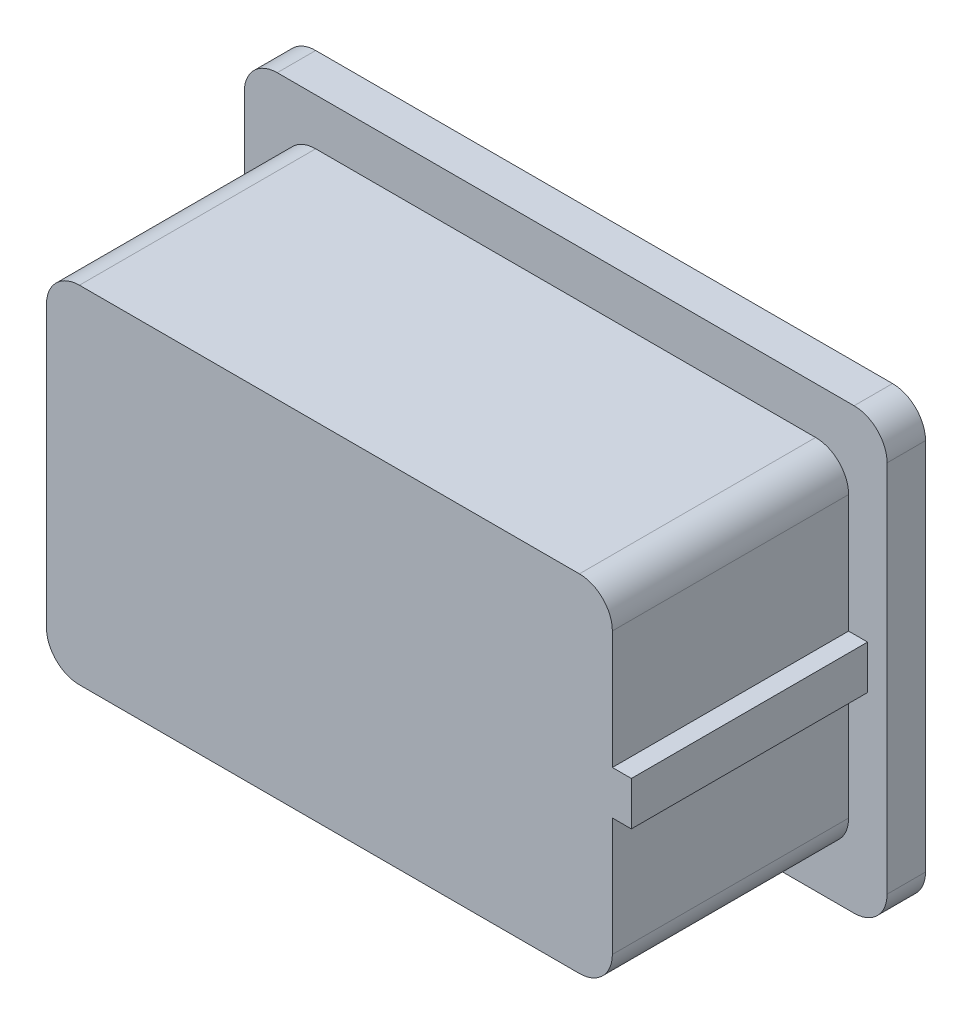
ISO-10303-21;
HEADER;
FILE_DESCRIPTION(('STEP AP214'),'2;1');
FILE_NAME('part.step','',(''),(''),'','','');
FILE_SCHEMA(('AUTOMOTIVE_DESIGN { 1 0 10303 214 1 1 1 1 }'));
ENDSEC;
DATA;
#1=APPLICATION_CONTEXT('core data for automotive mechanical design processes');
#2=APPLICATION_PROTOCOL_DEFINITION('international standard','automotive_design',2000,#1);
#3=PRODUCT_CONTEXT('',#1,'mechanical');
#4=PRODUCT('Part','Part','',(#3));
#5=PRODUCT_RELATED_PRODUCT_CATEGORY('part','',(#4));
#6=PRODUCT_DEFINITION_FORMATION('','',#4);
#7=PRODUCT_DEFINITION_CONTEXT('part definition',#1,'design');
#8=PRODUCT_DEFINITION('design','',#6,#7);
#9=PRODUCT_DEFINITION_SHAPE('','',#8);
#10=(LENGTH_UNIT() NAMED_UNIT(*) SI_UNIT(.MILLI.,.METRE.));
#11=(NAMED_UNIT(*) PLANE_ANGLE_UNIT() SI_UNIT($,.RADIAN.));
#12=(NAMED_UNIT(*) SI_UNIT($,.STERADIAN.) SOLID_ANGLE_UNIT());
#13=UNCERTAINTY_MEASURE_WITH_UNIT(LENGTH_MEASURE(1.E-05),#10,'distance_accuracy_value','');
#14=(GEOMETRIC_REPRESENTATION_CONTEXT(3) GLOBAL_UNCERTAINTY_ASSIGNED_CONTEXT((#13)) GLOBAL_UNIT_ASSIGNED_CONTEXT((#10,
#11,#12)) REPRESENTATION_CONTEXT('',''));
#15=CARTESIAN_POINT('',(0.,0.,0.));
#16=DIRECTION('',(0.,0.,1.));
#17=DIRECTION('',(1.,0.,0.));
#18=AXIS2_PLACEMENT_3D('',#15,#16,#17);
#19=CARTESIAN_POINT('',(25.75,-15.75,3.5));
#20=DIRECTION('',(1.,0.,0.));
#21=DIRECTION('',(0.,0.,-1.));
#22=AXIS2_PLACEMENT_3D('',#19,#20,#21);
#23=PLANE('',#22);
#24=DIRECTION('',(0.,1.,0.));
#25=VECTOR('',#24,1.);
#26=CARTESIAN_POINT('',(25.75,-15.75,3.5));
#27=LINE('',#26,#25);
#28=CARTESIAN_POINT('',(25.75,1.98869366048493,3.49999999997408));
#29=VERTEX_POINT('',#28);
#30=CARTESIAN_POINT('',(25.75,12.75,3.5));
#31=VERTEX_POINT('',#30);
#32=EDGE_CURVE('E218',#29,#31,#27,.T.);
#33=ORIENTED_EDGE('',*,*,#32,.T.);
#34=DIRECTION('',(0.,0.,1.));
#35=VECTOR('',#34,1.);
#36=CARTESIAN_POINT('',(25.75,12.75,3.5));
#37=LINE('',#36,#35);
#38=CARTESIAN_POINT('',(25.75,12.75,25.));
#39=VERTEX_POINT('',#38);
#40=EDGE_CURVE('E255',#31,#39,#37,.T.);
#41=ORIENTED_EDGE('',*,*,#40,.T.);
#42=DIRECTION('',(0.,1.,0.));
#43=VECTOR('',#42,1.);
#44=CARTESIAN_POINT('',(25.75,-15.75,25.));
#45=LINE('',#44,#43);
#46=CARTESIAN_POINT('',(25.75,1.98869366048493,25.));
#47=VERTEX_POINT('',#46);
#48=EDGE_CURVE('E205',#47,#39,#45,.T.);
#49=ORIENTED_EDGE('',*,*,#48,.F.);
#50=DIRECTION('',(0.,0.,-1.));
#51=VECTOR('',#50,1.);
#52=CARTESIAN_POINT('',(25.75,1.98869366048493,-500000.));
#53=LINE('',#52,#51);
#54=EDGE_CURVE('E209',#47,#29,#53,.T.);
#55=ORIENTED_EDGE('',*,*,#54,.T.);
#56=EDGE_LOOP('',(#33,#41,#49,#55));
#57=FACE_BOUND('',#56,.T.);
#58=ADVANCED_FACE('F35',(#57),#23,.T.);
#59=CARTESIAN_POINT('',(29.25,20.,25.));
#60=DIRECTION('',(-1.,0.,0.));
#61=DIRECTION('',(0.,0.,1.));
#62=AXIS2_PLACEMENT_3D('',#59,#60,#61);
#63=PLANE('',#62);
#64=DIRECTION('',(0.,1.,0.));
#65=VECTOR('',#64,1.);
#66=CARTESIAN_POINT('',(29.25,20.,0.));
#67=LINE('',#66,#65);
#68=CARTESIAN_POINT('',(29.25,-17.,0.));
#69=VERTEX_POINT('',#68);
#70=CARTESIAN_POINT('',(29.25,17.,0.));
#71=VERTEX_POINT('',#70);
#72=EDGE_CURVE('E242',#69,#71,#67,.T.);
#73=ORIENTED_EDGE('',*,*,#72,.T.);
#74=DIRECTION('',(0.,0.,-1.));
#75=VECTOR('',#74,1.);
#76=CARTESIAN_POINT('',(29.25,17.,25.));
#77=LINE('',#76,#75);
#78=CARTESIAN_POINT('',(29.25,17.,3.5));
#79=VERTEX_POINT('',#78);
#80=EDGE_CURVE('E308',#71,#79,#77,.F.);
#81=ORIENTED_EDGE('',*,*,#80,.T.);
#82=DIRECTION('',(0.,1.,0.));
#83=VECTOR('',#82,1.);
#84=CARTESIAN_POINT('',(29.25,20.,3.5));
#85=LINE('',#84,#83);
#86=CARTESIAN_POINT('',(29.25,-17.,3.5));
#87=VERTEX_POINT('',#86);
#88=EDGE_CURVE('E239',#87,#79,#85,.T.);
#89=ORIENTED_EDGE('',*,*,#88,.F.);
#90=DIRECTION('',(0.,0.,-1.));
#91=VECTOR('',#90,1.);
#92=CARTESIAN_POINT('',(29.25,-17.,25.));
#93=LINE('',#92,#91);
#94=EDGE_CURVE('E305',#87,#69,#93,.T.);
#95=ORIENTED_EDGE('',*,*,#94,.T.);
#96=EDGE_LOOP('',(#73,#81,#89,#95));
#97=FACE_BOUND('',#96,.T.);
#98=ADVANCED_FACE('F342',(#97),#63,.F.);
#99=CARTESIAN_POINT('',(-29.25,20.,25.));
#100=DIRECTION('',(0.,-1.,0.));
#101=DIRECTION('',(0.,0.,-1.));
#102=AXIS2_PLACEMENT_3D('',#99,#100,#101);
#103=PLANE('',#102);
#104=DIRECTION('',(-1.,0.,0.));
#105=VECTOR('',#104,1.);
#106=CARTESIAN_POINT('',(-29.25,20.,3.5));
#107=LINE('',#106,#105);
#108=CARTESIAN_POINT('',(26.25,20.,3.5));
#109=VERTEX_POINT('',#108);
#110=CARTESIAN_POINT('',(-26.25,20.,3.5));
#111=VERTEX_POINT('',#110);
#112=EDGE_CURVE('E236',#109,#111,#107,.T.);
#113=ORIENTED_EDGE('',*,*,#112,.F.);
#114=DIRECTION('',(0.,0.,-1.));
#115=VECTOR('',#114,1.);
#116=CARTESIAN_POINT('',(26.25,20.,25.));
#117=LINE('',#116,#115);
#118=CARTESIAN_POINT('',(26.25,20.,0.));
#119=VERTEX_POINT('',#118);
#120=EDGE_CURVE('E294',#109,#119,#117,.T.);
#121=ORIENTED_EDGE('',*,*,#120,.T.);
#122=DIRECTION('',(-1.,0.,0.));
#123=VECTOR('',#122,1.);
#124=CARTESIAN_POINT('',(-29.25,20.,0.));
#125=LINE('',#124,#123);
#126=CARTESIAN_POINT('',(-26.25,20.,0.));
#127=VERTEX_POINT('',#126);
#128=EDGE_CURVE('E245',#119,#127,#125,.T.);
#129=ORIENTED_EDGE('',*,*,#128,.T.);
#130=DIRECTION('',(0.,0.,-1.));
#131=VECTOR('',#130,1.);
#132=CARTESIAN_POINT('',(-26.25,20.,25.));
#133=LINE('',#132,#131);
#134=EDGE_CURVE('E292',#127,#111,#133,.F.);
#135=ORIENTED_EDGE('',*,*,#134,.T.);
#136=EDGE_LOOP('',(#113,#121,#129,#135));
#137=FACE_BOUND('',#136,.T.);
#138=ADVANCED_FACE('F350',(#137),#103,.F.);
#139=CARTESIAN_POINT('',(-29.25,20.,25.));
#140=DIRECTION('',(1.,0.,0.));
#141=DIRECTION('',(0.,1.,0.));
#142=AXIS2_PLACEMENT_3D('',#139,#140,#141);
#143=PLANE('',#142);
#144=DIRECTION('',(0.,-1.,0.));
#145=VECTOR('',#144,1.);
#146=CARTESIAN_POINT('',(-29.25,20.,3.5));
#147=LINE('',#146,#145);
#148=CARTESIAN_POINT('',(-29.25,17.,3.5));
#149=VERTEX_POINT('',#148);
#150=CARTESIAN_POINT('',(-29.25,-17.,3.5));
#151=VERTEX_POINT('',#150);
#152=EDGE_CURVE('E226',#149,#151,#147,.T.);
#153=ORIENTED_EDGE('',*,*,#152,.F.);
#154=DIRECTION('',(0.,0.,-1.));
#155=VECTOR('',#154,1.);
#156=CARTESIAN_POINT('',(-29.25,17.,25.));
#157=LINE('',#156,#155);
#158=CARTESIAN_POINT('',(-29.25,17.,0.));
#159=VERTEX_POINT('',#158);
#160=EDGE_CURVE('E12',#149,#159,#157,.T.);
#161=ORIENTED_EDGE('',*,*,#160,.T.);
#162=DIRECTION('',(0.,-1.,0.));
#163=VECTOR('',#162,1.);
#164=CARTESIAN_POINT('',(-29.25,20.,0.));
#165=LINE('',#164,#163);
#166=CARTESIAN_POINT('',(-29.25,-17.,0.));
#167=VERTEX_POINT('',#166);
#168=EDGE_CURVE('E248',#159,#167,#165,.T.);
#169=ORIENTED_EDGE('',*,*,#168,.T.);
#170=DIRECTION('',(0.,0.,-1.));
#171=VECTOR('',#170,1.);
#172=CARTESIAN_POINT('',(-29.25,-17.,25.));
#173=LINE('',#172,#171);
#174=EDGE_CURVE('E43',#167,#151,#173,.F.);
#175=ORIENTED_EDGE('',*,*,#174,.T.);
#176=EDGE_LOOP('',(#153,#161,#169,#175));
#177=FACE_BOUND('',#176,.T.);
#178=ADVANCED_FACE('F323',(#177),#143,.F.);
#179=CARTESIAN_POINT('',(-29.25,-20.,25.));
#180=DIRECTION('',(0.,1.,0.));
#181=DIRECTION('',(0.,0.,1.));
#182=AXIS2_PLACEMENT_3D('',#179,#180,#181);
#183=PLANE('',#182);
#184=DIRECTION('',(1.,0.,0.));
#185=VECTOR('',#184,1.);
#186=CARTESIAN_POINT('',(-29.25,-20.,0.));
#187=LINE('',#186,#185);
#188=CARTESIAN_POINT('',(-26.25,-20.,0.));
#189=VERTEX_POINT('',#188);
#190=CARTESIAN_POINT('',(26.25,-20.,0.));
#191=VERTEX_POINT('',#190);
#192=EDGE_CURVE('E251',#189,#191,#187,.T.);
#193=ORIENTED_EDGE('',*,*,#192,.T.);
#194=DIRECTION('',(0.,0.,-1.));
#195=VECTOR('',#194,1.);
#196=CARTESIAN_POINT('',(26.25,-20.,25.));
#197=LINE('',#196,#195);
#198=CARTESIAN_POINT('',(26.25,-20.,3.50000000000001));
#199=VERTEX_POINT('',#198);
#200=EDGE_CURVE('E50',#191,#199,#197,.F.);
#201=ORIENTED_EDGE('',*,*,#200,.T.);
#202=DIRECTION('',(1.,0.,0.));
#203=VECTOR('',#202,1.);
#204=CARTESIAN_POINT('',(-29.25,-20.,3.50000000000001));
#205=LINE('',#204,#203);
#206=CARTESIAN_POINT('',(-26.25,-20.,3.50000000000001));
#207=VERTEX_POINT('',#206);
#208=EDGE_CURVE('E253',#207,#199,#205,.T.);
#209=ORIENTED_EDGE('',*,*,#208,.F.);
#210=DIRECTION('',(0.,0.,-1.));
#211=VECTOR('',#210,1.);
#212=CARTESIAN_POINT('',(-26.25,-20.,25.));
#213=LINE('',#212,#211);
#214=EDGE_CURVE('E317',#207,#189,#213,.T.);
#215=ORIENTED_EDGE('',*,*,#214,.T.);
#216=EDGE_LOOP('',(#193,#201,#209,#215));
#217=FACE_BOUND('',#216,.T.);
#218=ADVANCED_FACE('F331',(#217),#183,.F.);
#219=CARTESIAN_POINT('',(0.,0.,0.));
#220=DIRECTION('',(0.,0.,1.));
#221=DIRECTION('',(1.,0.,0.));
#222=AXIS2_PLACEMENT_3D('',#219,#220,#221);
#223=PLANE('',#222);
#224=ORIENTED_EDGE('',*,*,#128,.F.);
#225=CARTESIAN_POINT('',(26.25,17.,0.));
#226=DIRECTION('',(0.,0.,1.));
#227=DIRECTION('',(1.,0.,0.));
#228=AXIS2_PLACEMENT_3D('',#225,#226,#227);
#229=CIRCLE('',#228,3.);
#230=EDGE_CURVE('E303',#119,#71,#229,.F.);
#231=ORIENTED_EDGE('',*,*,#230,.T.);
#232=ORIENTED_EDGE('',*,*,#72,.F.);
#233=CARTESIAN_POINT('',(26.25,-17.,0.));
#234=DIRECTION('',(0.,0.,1.));
#235=DIRECTION('',(1.,0.,0.));
#236=AXIS2_PLACEMENT_3D('',#233,#234,#235);
#237=CIRCLE('',#236,3.);
#238=EDGE_CURVE('E301',#69,#191,#237,.F.);
#239=ORIENTED_EDGE('',*,*,#238,.T.);
#240=ORIENTED_EDGE('',*,*,#192,.F.);
#241=CARTESIAN_POINT('',(-26.25,-17.,0.));
#242=DIRECTION('',(0.,0.,1.));
#243=DIRECTION('',(1.,0.,0.));
#244=AXIS2_PLACEMENT_3D('',#241,#242,#243);
#245=CIRCLE('',#244,3.);
#246=EDGE_CURVE('E297',#189,#167,#245,.F.);
#247=ORIENTED_EDGE('',*,*,#246,.T.);
#248=ORIENTED_EDGE('',*,*,#168,.F.);
#249=CARTESIAN_POINT('',(-26.25,17.,0.));
#250=DIRECTION('',(0.,0.,1.));
#251=DIRECTION('',(1.,0.,0.));
#252=AXIS2_PLACEMENT_3D('',#249,#250,#251);
#253=CIRCLE('',#252,3.);
#254=EDGE_CURVE('E299',#159,#127,#253,.F.);
#255=ORIENTED_EDGE('',*,*,#254,.T.);
#256=EDGE_LOOP('',(#224,#231,#232,#239,#240,#247,#248,#255));
#257=FACE_BOUND('',#256,.T.);
#258=ADVANCED_FACE('F334',(#257),#223,.F.);
#259=CARTESIAN_POINT('',(0.,0.,3.5));
#260=DIRECTION('',(0.,0.,1.));
#261=DIRECTION('',(1.,0.,0.));
#262=AXIS2_PLACEMENT_3D('',#259,#260,#261);
#263=PLANE('',#262);
#264=DIRECTION('',(1.,0.,0.));
#265=VECTOR('',#264,1.);
#266=CARTESIAN_POINT('',(24.0210696294591,1.98869366048493,3.49999999997408));
#267=LINE('',#266,#265);
#268=CARTESIAN_POINT('',(27.4789303705409,1.98869366048493,3.49999999997408));
#269=VERTEX_POINT('',#268);
#270=EDGE_CURVE('E208',#29,#269,#267,.T.);
#271=ORIENTED_EDGE('',*,*,#270,.T.);
#272=DIRECTION('',(0.,-1.,0.));
#273=VECTOR('',#272,1.);
#274=CARTESIAN_POINT('',(27.4789303705409,1.98869366048493,3.49999999997408));
#275=LINE('',#274,#273);
#276=CARTESIAN_POINT('',(27.4789303705409,-1.98869366048492,3.49999999997408));
#277=VERTEX_POINT('',#276);
#278=EDGE_CURVE('E202',#269,#277,#275,.T.);
#279=ORIENTED_EDGE('',*,*,#278,.T.);
#280=DIRECTION('',(-1.,0.,0.));
#281=VECTOR('',#280,1.);
#282=CARTESIAN_POINT('',(24.0210696294591,-1.98869366048492,3.49999999997408));
#283=LINE('',#282,#281);
#284=CARTESIAN_POINT('',(25.75,-1.98869366048492,3.49999999997408));
#285=VERTEX_POINT('',#284);
#286=EDGE_CURVE('E181',#277,#285,#283,.T.);
#287=ORIENTED_EDGE('',*,*,#286,.T.);
#288=CARTESIAN_POINT('',(25.75,-12.75,3.5));
#289=VERTEX_POINT('',#288);
#290=EDGE_CURVE('E215',#289,#285,#27,.T.);
#291=ORIENTED_EDGE('',*,*,#290,.F.);
#292=CARTESIAN_POINT('',(22.75,-12.75,3.5));
#293=DIRECTION('',(0.,0.,1.));
#294=DIRECTION('',(1.,0.,0.));
#295=AXIS2_PLACEMENT_3D('',#292,#293,#294);
#296=CIRCLE('',#295,3.);
#297=CARTESIAN_POINT('',(22.75,-15.75,3.5));
#298=VERTEX_POINT('',#297);
#299=EDGE_CURVE('E271',#289,#298,#296,.F.);
#300=ORIENTED_EDGE('',*,*,#299,.T.);
#301=DIRECTION('',(1.,0.,0.));
#302=VECTOR('',#301,1.);
#303=CARTESIAN_POINT('',(-25.75,-15.75,3.5));
#304=LINE('',#303,#302);
#305=CARTESIAN_POINT('',(-22.75,-15.75,3.5));
#306=VERTEX_POINT('',#305);
#307=EDGE_CURVE('E224',#306,#298,#304,.T.);
#308=ORIENTED_EDGE('',*,*,#307,.F.);
#309=CARTESIAN_POINT('',(-22.75,-12.75,3.5));
#310=DIRECTION('',(0.,0.,1.));
#311=DIRECTION('',(1.,0.,0.));
#312=AXIS2_PLACEMENT_3D('',#309,#310,#311);
#313=CIRCLE('',#312,3.);
#314=CARTESIAN_POINT('',(-25.75,-12.75,3.5));
#315=VERTEX_POINT('',#314);
#316=EDGE_CURVE('E290',#306,#315,#313,.F.);
#317=ORIENTED_EDGE('',*,*,#316,.T.);
#318=DIRECTION('',(0.,-1.,0.));
#319=VECTOR('',#318,1.);
#320=CARTESIAN_POINT('',(-25.75,-15.75,3.5));
#321=LINE('',#320,#319);
#322=CARTESIAN_POINT('',(-25.75,12.75,3.5));
#323=VERTEX_POINT('',#322);
#324=EDGE_CURVE('E221',#323,#315,#321,.T.);
#325=ORIENTED_EDGE('',*,*,#324,.F.);
#326=CARTESIAN_POINT('',(-22.75,12.75,3.5));
#327=DIRECTION('',(0.,0.,1.));
#328=DIRECTION('',(1.,0.,0.));
#329=AXIS2_PLACEMENT_3D('',#326,#327,#328);
#330=CIRCLE('',#329,3.);
#331=CARTESIAN_POINT('',(-22.75,15.75,3.5));
#332=VERTEX_POINT('',#331);
#333=EDGE_CURVE('E288',#323,#332,#330,.F.);
#334=ORIENTED_EDGE('',*,*,#333,.T.);
#335=DIRECTION('',(-1.,0.,0.));
#336=VECTOR('',#335,1.);
#337=CARTESIAN_POINT('',(-25.75,15.75,3.5));
#338=LINE('',#337,#336);
#339=CARTESIAN_POINT('',(22.75,15.75,3.5));
#340=VERTEX_POINT('',#339);
#341=EDGE_CURVE('E217',#340,#332,#338,.T.);
#342=ORIENTED_EDGE('',*,*,#341,.F.);
#343=CARTESIAN_POINT('',(22.75,12.75,3.5));
#344=DIRECTION('',(0.,0.,1.));
#345=DIRECTION('',(1.,0.,0.));
#346=AXIS2_PLACEMENT_3D('',#343,#344,#345);
#347=CIRCLE('',#346,3.);
#348=EDGE_CURVE('E269',#340,#31,#347,.F.);
#349=ORIENTED_EDGE('',*,*,#348,.T.);
#350=ORIENTED_EDGE('',*,*,#32,.F.);
#351=EDGE_LOOP('',(#271,#279,#287,#291,#300,#308,#317,#325,#334,#342,#349,#350));
#352=FACE_BOUND('',#351,.T.);
#353=ORIENTED_EDGE('',*,*,#88,.T.);
#354=CARTESIAN_POINT('',(26.25,17.,3.5));
#355=DIRECTION('',(0.,0.,1.));
#356=DIRECTION('',(1.,0.,0.));
#357=AXIS2_PLACEMENT_3D('',#354,#355,#356);
#358=CIRCLE('',#357,3.);
#359=EDGE_CURVE('E315',#79,#109,#358,.T.);
#360=ORIENTED_EDGE('',*,*,#359,.T.);
#361=ORIENTED_EDGE('',*,*,#112,.T.);
#362=CARTESIAN_POINT('',(-26.25,17.,3.5));
#363=DIRECTION('',(0.,0.,1.));
#364=DIRECTION('',(1.,0.,0.));
#365=AXIS2_PLACEMENT_3D('',#362,#363,#364);
#366=CIRCLE('',#365,3.);
#367=EDGE_CURVE('E311',#111,#149,#366,.T.);
#368=ORIENTED_EDGE('',*,*,#367,.T.);
#369=ORIENTED_EDGE('',*,*,#152,.T.);
#370=CARTESIAN_POINT('',(-26.25,-17.,3.5));
#371=DIRECTION('',(0.,0.,1.));
#372=DIRECTION('',(1.,0.,0.));
#373=AXIS2_PLACEMENT_3D('',#370,#371,#372);
#374=CIRCLE('',#373,3.);
#375=EDGE_CURVE('E57',#151,#207,#374,.T.);
#376=ORIENTED_EDGE('',*,*,#375,.T.);
#377=ORIENTED_EDGE('',*,*,#208,.T.);
#378=CARTESIAN_POINT('',(26.25,-17.,3.5));
#379=DIRECTION('',(0.,0.,1.));
#380=DIRECTION('',(1.,0.,0.));
#381=AXIS2_PLACEMENT_3D('',#378,#379,#380);
#382=CIRCLE('',#381,3.);
#383=EDGE_CURVE('E313',#199,#87,#382,.T.);
#384=ORIENTED_EDGE('',*,*,#383,.T.);
#385=EDGE_LOOP('',(#353,#360,#361,#368,#369,#376,#377,#384));
#386=FACE_BOUND('',#385,.T.);
#387=ADVANCED_FACE('F327',(#352,#386),#263,.T.);
#388=CARTESIAN_POINT('',(25.75,-12.75,25.));
#389=VERTEX_POINT('',#388);
#390=CARTESIAN_POINT('',(25.75,-1.98869366048492,25.));
#391=VERTEX_POINT('',#390);
#392=EDGE_CURVE('E194',#389,#391,#45,.T.);
#393=ORIENTED_EDGE('',*,*,#392,.F.);
#394=DIRECTION('',(0.,0.,1.));
#395=VECTOR('',#394,1.);
#396=CARTESIAN_POINT('',(25.75,-12.75,3.5));
#397=LINE('',#396,#395);
#398=EDGE_CURVE('E267',#389,#289,#397,.F.);
#399=ORIENTED_EDGE('',*,*,#398,.T.);
#400=ORIENTED_EDGE('',*,*,#290,.T.);
#401=DIRECTION('',(0.,0.,1.));
#402=VECTOR('',#401,1.);
#403=CARTESIAN_POINT('',(25.75,-1.98869366048492,-500000.));
#404=LINE('',#403,#402);
#405=EDGE_CURVE('E206',#285,#391,#404,.T.);
#406=ORIENTED_EDGE('',*,*,#405,.T.);
#407=EDGE_LOOP('',(#393,#399,#400,#406));
#408=FACE_BOUND('',#407,.T.);
#409=ADVANCED_FACE('F363',(#408),#23,.T.);
#410=CARTESIAN_POINT('',(-25.75,-15.75,3.5));
#411=DIRECTION('',(0.,-1.,0.));
#412=DIRECTION('',(0.,0.,-1.));
#413=AXIS2_PLACEMENT_3D('',#410,#411,#412);
#414=PLANE('',#413);
#415=DIRECTION('',(1.,0.,0.));
#416=VECTOR('',#415,1.);
#417=CARTESIAN_POINT('',(-25.75,-15.75,25.));
#418=LINE('',#417,#416);
#419=CARTESIAN_POINT('',(-22.75,-15.75,25.));
#420=VERTEX_POINT('',#419);
#421=CARTESIAN_POINT('',(22.75,-15.75,25.));
#422=VERTEX_POINT('',#421);
#423=EDGE_CURVE('E233',#420,#422,#418,.T.);
#424=ORIENTED_EDGE('',*,*,#423,.F.);
#425=DIRECTION('',(0.,0.,1.));
#426=VECTOR('',#425,1.);
#427=CARTESIAN_POINT('',(-22.75,-15.75,3.5));
#428=LINE('',#427,#426);
#429=EDGE_CURVE('E286',#420,#306,#428,.F.);
#430=ORIENTED_EDGE('',*,*,#429,.T.);
#431=ORIENTED_EDGE('',*,*,#307,.T.);
#432=DIRECTION('',(0.,0.,1.));
#433=VECTOR('',#432,1.);
#434=CARTESIAN_POINT('',(22.75,-15.75,3.5));
#435=LINE('',#434,#433);
#436=EDGE_CURVE('E264',#298,#422,#435,.T.);
#437=ORIENTED_EDGE('',*,*,#436,.T.);
#438=EDGE_LOOP('',(#424,#430,#431,#437));
#439=FACE_BOUND('',#438,.T.);
#440=ADVANCED_FACE('F372',(#439),#414,.T.);
#441=CARTESIAN_POINT('',(-25.75,-15.75,3.5));
#442=DIRECTION('',(-1.,0.,0.));
#443=DIRECTION('',(0.,0.,1.));
#444=AXIS2_PLACEMENT_3D('',#441,#442,#443);
#445=PLANE('',#444);
#446=DIRECTION('',(0.,-1.,0.));
#447=VECTOR('',#446,1.);
#448=CARTESIAN_POINT('',(-25.75,-15.75,25.));
#449=LINE('',#448,#447);
#450=CARTESIAN_POINT('',(-25.75,12.75,25.));
#451=VERTEX_POINT('',#450);
#452=CARTESIAN_POINT('',(-25.75,-12.75,25.));
#453=VERTEX_POINT('',#452);
#454=EDGE_CURVE('E230',#451,#453,#449,.T.);
#455=ORIENTED_EDGE('',*,*,#454,.F.);
#456=DIRECTION('',(0.,0.,1.));
#457=VECTOR('',#456,1.);
#458=CARTESIAN_POINT('',(-25.75,12.75,3.5));
#459=LINE('',#458,#457);
#460=EDGE_CURVE('E284',#451,#323,#459,.F.);
#461=ORIENTED_EDGE('',*,*,#460,.T.);
#462=ORIENTED_EDGE('',*,*,#324,.T.);
#463=DIRECTION('',(0.,0.,1.));
#464=VECTOR('',#463,1.);
#465=CARTESIAN_POINT('',(-25.75,-12.75,3.5));
#466=LINE('',#465,#464);
#467=EDGE_CURVE('E281',#315,#453,#466,.T.);
#468=ORIENTED_EDGE('',*,*,#467,.T.);
#469=EDGE_LOOP('',(#455,#461,#462,#468));
#470=FACE_BOUND('',#469,.T.);
#471=ADVANCED_FACE('F378',(#470),#445,.T.);
#472=CARTESIAN_POINT('',(-25.75,15.75,3.5));
#473=DIRECTION('',(0.,1.,0.));
#474=DIRECTION('',(0.,0.,1.));
#475=AXIS2_PLACEMENT_3D('',#472,#473,#474);
#476=PLANE('',#475);
#477=ORIENTED_EDGE('',*,*,#341,.T.);
#478=DIRECTION('',(0.,0.,1.));
#479=VECTOR('',#478,1.);
#480=CARTESIAN_POINT('',(-22.75,15.75,3.5));
#481=LINE('',#480,#479);
#482=CARTESIAN_POINT('',(-22.75,15.75,25.));
#483=VERTEX_POINT('',#482);
#484=EDGE_CURVE('E274',#332,#483,#481,.T.);
#485=ORIENTED_EDGE('',*,*,#484,.T.);
#486=DIRECTION('',(-1.,0.,0.));
#487=VECTOR('',#486,1.);
#488=CARTESIAN_POINT('',(-25.75,15.75,25.));
#489=LINE('',#488,#487);
#490=CARTESIAN_POINT('',(22.75,15.75,25.));
#491=VERTEX_POINT('',#490);
#492=EDGE_CURVE('E228',#491,#483,#489,.T.);
#493=ORIENTED_EDGE('',*,*,#492,.F.);
#494=DIRECTION('',(0.,0.,1.));
#495=VECTOR('',#494,1.);
#496=CARTESIAN_POINT('',(22.75,15.75,3.5));
#497=LINE('',#496,#495);
#498=EDGE_CURVE('E262',#491,#340,#497,.F.);
#499=ORIENTED_EDGE('',*,*,#498,.T.);
#500=EDGE_LOOP('',(#477,#485,#493,#499));
#501=FACE_BOUND('',#500,.T.);
#502=ADVANCED_FACE('F405',(#501),#476,.T.);
#503=CARTESIAN_POINT('',(0.,0.,25.));
#504=DIRECTION('',(0.,0.,1.));
#505=DIRECTION('',(1.,0.,0.));
#506=AXIS2_PLACEMENT_3D('',#503,#504,#505);
#507=PLANE('',#506);
#508=ORIENTED_EDGE('',*,*,#492,.T.);
#509=CARTESIAN_POINT('',(-22.75,12.75,25.));
#510=DIRECTION('',(0.,0.,1.));
#511=DIRECTION('',(1.,0.,0.));
#512=AXIS2_PLACEMENT_3D('',#509,#510,#511);
#513=CIRCLE('',#512,3.);
#514=EDGE_CURVE('E279',#483,#451,#513,.T.);
#515=ORIENTED_EDGE('',*,*,#514,.T.);
#516=ORIENTED_EDGE('',*,*,#454,.T.);
#517=CARTESIAN_POINT('',(-22.75,-12.75,25.));
#518=DIRECTION('',(0.,0.,1.));
#519=DIRECTION('',(1.,0.,0.));
#520=AXIS2_PLACEMENT_3D('',#517,#518,#519);
#521=CIRCLE('',#520,3.);
#522=EDGE_CURVE('E277',#453,#420,#521,.T.);
#523=ORIENTED_EDGE('',*,*,#522,.T.);
#524=ORIENTED_EDGE('',*,*,#423,.T.);
#525=CARTESIAN_POINT('',(22.75,-12.75,25.));
#526=DIRECTION('',(0.,0.,1.));
#527=DIRECTION('',(1.,0.,0.));
#528=AXIS2_PLACEMENT_3D('',#525,#526,#527);
#529=CIRCLE('',#528,3.);
#530=EDGE_CURVE('E258',#422,#389,#529,.T.);
#531=ORIENTED_EDGE('',*,*,#530,.T.);
#532=ORIENTED_EDGE('',*,*,#392,.T.);
#533=DIRECTION('',(1.,0.,0.));
#534=VECTOR('',#533,1.);
#535=CARTESIAN_POINT('',(24.0210696294591,-1.98869366048492,25.));
#536=LINE('',#535,#534);
#537=CARTESIAN_POINT('',(27.4789303705409,-1.98869366048492,25.));
#538=VERTEX_POINT('',#537);
#539=EDGE_CURVE('E178',#391,#538,#536,.T.);
#540=ORIENTED_EDGE('',*,*,#539,.T.);
#541=DIRECTION('',(0.,1.,0.));
#542=VECTOR('',#541,1.);
#543=CARTESIAN_POINT('',(27.4789303705409,1.98869366048493,25.));
#544=LINE('',#543,#542);
#545=CARTESIAN_POINT('',(27.4789303705409,1.98869366048493,25.));
#546=VERTEX_POINT('',#545);
#547=EDGE_CURVE('E192',#538,#546,#544,.T.);
#548=ORIENTED_EDGE('',*,*,#547,.T.);
#549=DIRECTION('',(-1.,0.,0.));
#550=VECTOR('',#549,1.);
#551=CARTESIAN_POINT('',(24.0210696294591,1.98869366048493,25.));
#552=LINE('',#551,#550);
#553=EDGE_CURVE('E186',#546,#47,#552,.T.);
#554=ORIENTED_EDGE('',*,*,#553,.T.);
#555=ORIENTED_EDGE('',*,*,#48,.T.);
#556=CARTESIAN_POINT('',(22.75,12.75,25.));
#557=DIRECTION('',(0.,0.,1.));
#558=DIRECTION('',(1.,0.,0.));
#559=AXIS2_PLACEMENT_3D('',#556,#557,#558);
#560=CIRCLE('',#559,3.);
#561=EDGE_CURVE('E260',#39,#491,#560,.T.);
#562=ORIENTED_EDGE('',*,*,#561,.T.);
#563=EDGE_LOOP('',(#508,#515,#516,#523,#524,#531,#532,#540,#548,#554,#555,#562));
#564=FACE_BOUND('',#563,.T.);
#565=ADVANCED_FACE('F191',(#564),#507,.T.);
#566=CARTESIAN_POINT('',(24.0210696294591,1.98869366048493,-500000.));
#567=DIRECTION('',(0.,1.,0.));
#568=DIRECTION('',(0.,0.,1.));
#569=AXIS2_PLACEMENT_3D('',#566,#567,#568);
#570=PLANE('',#569);
#571=ORIENTED_EDGE('',*,*,#54,.F.);
#572=ORIENTED_EDGE('',*,*,#553,.F.);
#573=DIRECTION('',(0.,0.,1.));
#574=VECTOR('',#573,1.);
#575=CARTESIAN_POINT('',(27.4789303705409,1.98869366048493,-500000.));
#576=LINE('',#575,#574);
#577=EDGE_CURVE('E185',#269,#546,#576,.T.);
#578=ORIENTED_EDGE('',*,*,#577,.F.);
#579=ORIENTED_EDGE('',*,*,#270,.F.);
#580=EDGE_LOOP('',(#571,#572,#578,#579));
#581=FACE_BOUND('',#580,.T.);
#582=ADVANCED_FACE('F394',(#581),#570,.T.);
#583=CARTESIAN_POINT('',(27.4789303705409,1.98869366048493,-500000.));
#584=DIRECTION('',(1.,0.,0.));
#585=DIRECTION('',(0.,0.,-1.));
#586=AXIS2_PLACEMENT_3D('',#583,#584,#585);
#587=PLANE('',#586);
#588=ORIENTED_EDGE('',*,*,#278,.F.);
#589=ORIENTED_EDGE('',*,*,#577,.T.);
#590=ORIENTED_EDGE('',*,*,#547,.F.);
#591=DIRECTION('',(0.,0.,1.));
#592=VECTOR('',#591,1.);
#593=CARTESIAN_POINT('',(27.4789303705409,-1.98869366048492,-500000.));
#594=LINE('',#593,#592);
#595=EDGE_CURVE('E174',#277,#538,#594,.T.);
#596=ORIENTED_EDGE('',*,*,#595,.F.);
#597=EDGE_LOOP('',(#588,#589,#590,#596));
#598=FACE_BOUND('',#597,.T.);
#599=ADVANCED_FACE('F196',(#598),#587,.T.);
#600=CARTESIAN_POINT('',(24.0210696294591,-1.98869366048492,-500000.));
#601=DIRECTION('',(0.,-1.,0.));
#602=DIRECTION('',(0.,0.,-1.));
#603=AXIS2_PLACEMENT_3D('',#600,#601,#602);
#604=PLANE('',#603);
#605=ORIENTED_EDGE('',*,*,#405,.F.);
#606=ORIENTED_EDGE('',*,*,#286,.F.);
#607=ORIENTED_EDGE('',*,*,#595,.T.);
#608=ORIENTED_EDGE('',*,*,#539,.F.);
#609=EDGE_LOOP('',(#605,#606,#607,#608));
#610=FACE_BOUND('',#609,.T.);
#611=ADVANCED_FACE('F177',(#610),#604,.T.);
#612=CARTESIAN_POINT('',(22.75,12.75,3.5));
#613=DIRECTION('',(0.,0.,1.));
#614=DIRECTION('',(1.,0.,0.));
#615=AXIS2_PLACEMENT_3D('',#612,#613,#614);
#616=CYLINDRICAL_SURFACE('',#615,3.);
#617=ORIENTED_EDGE('',*,*,#348,.F.);
#618=ORIENTED_EDGE('',*,*,#498,.F.);
#619=ORIENTED_EDGE('',*,*,#561,.F.);
#620=ORIENTED_EDGE('',*,*,#40,.F.);
#621=EDGE_LOOP('',(#617,#618,#619,#620));
#622=FACE_BOUND('',#621,.T.);
#623=ADVANCED_FACE('F401',(#622),#616,.T.);
#624=CARTESIAN_POINT('',(22.75,-12.75,3.5));
#625=DIRECTION('',(0.,0.,1.));
#626=DIRECTION('',(1.,0.,0.));
#627=AXIS2_PLACEMENT_3D('',#624,#625,#626);
#628=CYLINDRICAL_SURFACE('',#627,3.);
#629=ORIENTED_EDGE('',*,*,#299,.F.);
#630=ORIENTED_EDGE('',*,*,#398,.F.);
#631=ORIENTED_EDGE('',*,*,#530,.F.);
#632=ORIENTED_EDGE('',*,*,#436,.F.);
#633=EDGE_LOOP('',(#629,#630,#631,#632));
#634=FACE_BOUND('',#633,.T.);
#635=ADVANCED_FACE('F387',(#634),#628,.T.);
#636=CARTESIAN_POINT('',(-22.75,12.75,3.5));
#637=DIRECTION('',(0.,0.,1.));
#638=DIRECTION('',(1.,0.,0.));
#639=AXIS2_PLACEMENT_3D('',#636,#637,#638);
#640=CYLINDRICAL_SURFACE('',#639,3.);
#641=ORIENTED_EDGE('',*,*,#333,.F.);
#642=ORIENTED_EDGE('',*,*,#460,.F.);
#643=ORIENTED_EDGE('',*,*,#514,.F.);
#644=ORIENTED_EDGE('',*,*,#484,.F.);
#645=EDGE_LOOP('',(#641,#642,#643,#644));
#646=FACE_BOUND('',#645,.T.);
#647=ADVANCED_FACE('F411',(#646),#640,.T.);
#648=CARTESIAN_POINT('',(-22.75,-12.75,3.5));
#649=DIRECTION('',(0.,0.,1.));
#650=DIRECTION('',(1.,0.,0.));
#651=AXIS2_PLACEMENT_3D('',#648,#649,#650);
#652=CYLINDRICAL_SURFACE('',#651,3.);
#653=ORIENTED_EDGE('',*,*,#316,.F.);
#654=ORIENTED_EDGE('',*,*,#429,.F.);
#655=ORIENTED_EDGE('',*,*,#522,.F.);
#656=ORIENTED_EDGE('',*,*,#467,.F.);
#657=EDGE_LOOP('',(#653,#654,#655,#656));
#658=FACE_BOUND('',#657,.T.);
#659=ADVANCED_FACE('F416',(#658),#652,.T.);
#660=CARTESIAN_POINT('',(26.25,17.,25.));
#661=DIRECTION('',(0.,0.,-1.));
#662=DIRECTION('',(-1.,0.,0.));
#663=AXIS2_PLACEMENT_3D('',#660,#661,#662);
#664=CYLINDRICAL_SURFACE('',#663,3.);
#665=ORIENTED_EDGE('',*,*,#359,.F.);
#666=ORIENTED_EDGE('',*,*,#80,.F.);
#667=ORIENTED_EDGE('',*,*,#230,.F.);
#668=ORIENTED_EDGE('',*,*,#120,.F.);
#669=EDGE_LOOP('',(#665,#666,#667,#668));
#670=FACE_BOUND('',#669,.T.);
#671=ADVANCED_FACE('F348',(#670),#664,.T.);
#672=CARTESIAN_POINT('',(26.25,-17.,25.));
#673=DIRECTION('',(0.,0.,-1.));
#674=DIRECTION('',(-1.,0.,0.));
#675=AXIS2_PLACEMENT_3D('',#672,#673,#674);
#676=CYLINDRICAL_SURFACE('',#675,3.);
#677=ORIENTED_EDGE('',*,*,#383,.F.);
#678=ORIENTED_EDGE('',*,*,#200,.F.);
#679=ORIENTED_EDGE('',*,*,#238,.F.);
#680=ORIENTED_EDGE('',*,*,#94,.F.);
#681=EDGE_LOOP('',(#677,#678,#679,#680));
#682=FACE_BOUND('',#681,.T.);
#683=ADVANCED_FACE('F339',(#682),#676,.T.);
#684=CARTESIAN_POINT('',(-26.25,17.,25.));
#685=DIRECTION('',(0.,0.,-1.));
#686=DIRECTION('',(-1.,0.,0.));
#687=AXIS2_PLACEMENT_3D('',#684,#685,#686);
#688=CYLINDRICAL_SURFACE('',#687,3.);
#689=ORIENTED_EDGE('',*,*,#367,.F.);
#690=ORIENTED_EDGE('',*,*,#134,.F.);
#691=ORIENTED_EDGE('',*,*,#254,.F.);
#692=ORIENTED_EDGE('',*,*,#160,.F.);
#693=EDGE_LOOP('',(#689,#690,#691,#692));
#694=FACE_BOUND('',#693,.T.);
#695=ADVANCED_FACE('F353',(#694),#688,.T.);
#696=CARTESIAN_POINT('',(-26.25,-17.,25.));
#697=DIRECTION('',(0.,0.,-1.));
#698=DIRECTION('',(-1.,0.,0.));
#699=AXIS2_PLACEMENT_3D('',#696,#697,#698);
#700=CYLINDRICAL_SURFACE('',#699,3.);
#701=ORIENTED_EDGE('',*,*,#375,.F.);
#702=ORIENTED_EDGE('',*,*,#174,.F.);
#703=ORIENTED_EDGE('',*,*,#246,.F.);
#704=ORIENTED_EDGE('',*,*,#214,.F.);
#705=EDGE_LOOP('',(#701,#702,#703,#704));
#706=FACE_BOUND('',#705,.T.);
#707=ADVANCED_FACE('F37',(#706),#700,.T.);
#708=CLOSED_SHELL('',(#58,#98,#138,#178,#218,#258,#387,#409,#440,#471,#502,#565,#582,#599,#611,
#623,#635,#647,#659,#671,#683,#695,#707));
#709=MANIFOLD_SOLID_BREP('B2',#708);
#710=ADVANCED_BREP_SHAPE_REPRESENTATION('',(#18,#709),#14);
#711=SHAPE_DEFINITION_REPRESENTATION(#9,#710);
ENDSEC;
END-ISO-10303-21;
